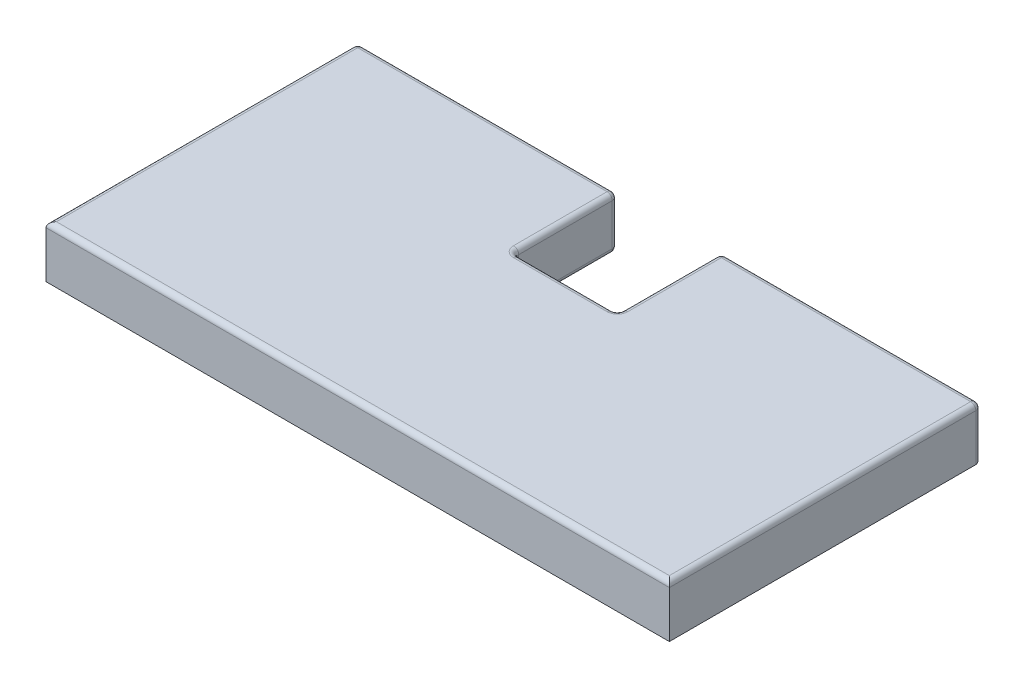
ISO-10303-21;
HEADER;
FILE_DESCRIPTION(('STEP AP214'),'2;1');
FILE_NAME('part.step','',(''),(''),'','','');
FILE_SCHEMA(('AUTOMOTIVE_DESIGN { 1 0 10303 214 1 1 1 1 }'));
ENDSEC;
DATA;
#1=APPLICATION_CONTEXT('core data for automotive mechanical design processes');
#2=APPLICATION_PROTOCOL_DEFINITION('international standard','automotive_design',2000,#1);
#3=PRODUCT_CONTEXT('',#1,'mechanical');
#4=PRODUCT('Part','Part','',(#3));
#5=PRODUCT_RELATED_PRODUCT_CATEGORY('part','',(#4));
#6=PRODUCT_DEFINITION_FORMATION('','',#4);
#7=PRODUCT_DEFINITION_CONTEXT('part definition',#1,'design');
#8=PRODUCT_DEFINITION('design','',#6,#7);
#9=PRODUCT_DEFINITION_SHAPE('','',#8);
#10=(LENGTH_UNIT() NAMED_UNIT(*) SI_UNIT(.MILLI.,.METRE.));
#11=(NAMED_UNIT(*) PLANE_ANGLE_UNIT() SI_UNIT($,.RADIAN.));
#12=(NAMED_UNIT(*) SI_UNIT($,.STERADIAN.) SOLID_ANGLE_UNIT());
#13=UNCERTAINTY_MEASURE_WITH_UNIT(LENGTH_MEASURE(1.E-05),#10,'distance_accuracy_value','');
#14=(GEOMETRIC_REPRESENTATION_CONTEXT(3) GLOBAL_UNCERTAINTY_ASSIGNED_CONTEXT((#13)) GLOBAL_UNIT_ASSIGNED_CONTEXT((#10,
#11,#12)) REPRESENTATION_CONTEXT('',''));
#15=CARTESIAN_POINT('',(0.,0.,0.));
#16=DIRECTION('',(0.,0.,1.));
#17=DIRECTION('',(1.,0.,0.));
#18=AXIS2_PLACEMENT_3D('',#15,#16,#17);
#19=CARTESIAN_POINT('',(-516.052613815904,5.,-370.540919523258));
#20=DIRECTION('',(0.,0.,-1.));
#21=DIRECTION('',(-1.,0.,0.));
#22=AXIS2_PLACEMENT_3D('',#19,#20,#21);
#23=PLANE('',#22);
#24=DIRECTION('',(1.,0.,0.));
#25=VECTOR('',#24,1.);
#26=CARTESIAN_POINT('',(-516.052613815904,4.5,-370.540919523258));
#27=LINE('',#26,#25);
#28=CARTESIAN_POINT('',(-515.552613815904,4.5,-370.540919523258));
#29=VERTEX_POINT('',#28);
#30=CARTESIAN_POINT('',(-491.552613815904,4.5,-370.540919523258));
#31=VERTEX_POINT('',#30);
#32=EDGE_CURVE('E245',#29,#31,#27,.T.);
#33=ORIENTED_EDGE('',*,*,#32,.T.);
#34=DIRECTION('',(0.,-1.,0.));
#35=VECTOR('',#34,1.);
#36=CARTESIAN_POINT('',(-491.552613815904,5.,-370.540919523258));
#37=LINE('',#36,#35);
#38=CARTESIAN_POINT('',(-491.552613815904,0.5,-370.540919523258));
#39=VERTEX_POINT('',#38);
#40=EDGE_CURVE('E249',#31,#39,#37,.T.);
#41=ORIENTED_EDGE('',*,*,#40,.T.);
#42=DIRECTION('',(1.,0.,0.));
#43=VECTOR('',#42,1.);
#44=CARTESIAN_POINT('',(-516.052613815904,0.5,-370.540919523258));
#45=LINE('',#44,#43);
#46=CARTESIAN_POINT('',(-515.552613815904,0.5,-370.540919523258));
#47=VERTEX_POINT('',#46);
#48=EDGE_CURVE('E247',#39,#47,#45,.F.);
#49=ORIENTED_EDGE('',*,*,#48,.T.);
#50=DIRECTION('',(0.,-1.,0.));
#51=VECTOR('',#50,1.);
#52=CARTESIAN_POINT('',(-515.552613815904,5.,-370.540919523258));
#53=LINE('',#52,#51);
#54=EDGE_CURVE('E243',#47,#29,#53,.F.);
#55=ORIENTED_EDGE('',*,*,#54,.T.);
#56=EDGE_LOOP('',(#33,#41,#49,#55));
#57=FACE_BOUND('',#56,.T.);
#58=ADVANCED_FACE('F34',(#57),#23,.T.);
#59=CARTESIAN_POINT('',(0.,5.,0.));
#60=DIRECTION('',(0.,1.,0.));
#61=DIRECTION('',(0.,0.,1.));
#62=AXIS2_PLACEMENT_3D('',#59,#60,#61);
#63=PLANE('',#62);
#64=DIRECTION('',(1.,0.,0.));
#65=VECTOR('',#64,1.);
#66=CARTESIAN_POINT('',(-456.052613815904,5.,-341.040919523258));
#67=LINE('',#66,#65);
#68=CARTESIAN_POINT('',(-515.552613815904,5.,-341.040919523258));
#69=VERTEX_POINT('',#68);
#70=CARTESIAN_POINT('',(-456.552613815904,5.,-341.040919523258));
#71=VERTEX_POINT('',#70);
#72=EDGE_CURVE('E272',#69,#71,#67,.T.);
#73=ORIENTED_EDGE('',*,*,#72,.T.);
#74=DIRECTION('',(0.,0.,1.));
#75=VECTOR('',#74,1.);
#76=CARTESIAN_POINT('',(-456.552613815904,5.,0.));
#77=LINE('',#76,#75);
#78=CARTESIAN_POINT('',(-456.552613815904,5.,-370.040919523258));
#79=VERTEX_POINT('',#78);
#80=EDGE_CURVE('E281',#71,#79,#77,.F.);
#81=ORIENTED_EDGE('',*,*,#80,.T.);
#82=DIRECTION('',(1.,0.,0.));
#83=VECTOR('',#82,1.);
#84=CARTESIAN_POINT('',(0.,5.,-370.040919523258));
#85=LINE('',#84,#83);
#86=CARTESIAN_POINT('',(-480.552613815904,5.,-370.040919523258));
#87=VERTEX_POINT('',#86);
#88=EDGE_CURVE('E279',#79,#87,#85,.F.);
#89=ORIENTED_EDGE('',*,*,#88,.T.);
#90=DIRECTION('',(0.,0.,-1.));
#91=VECTOR('',#90,1.);
#92=CARTESIAN_POINT('',(-480.552613815904,5.,-360.540919523258));
#93=LINE('',#92,#91);
#94=CARTESIAN_POINT('',(-480.552613815904,5.,-361.040919523258));
#95=VERTEX_POINT('',#94);
#96=EDGE_CURVE('E277',#87,#95,#93,.F.);
#97=ORIENTED_EDGE('',*,*,#96,.T.);
#98=CARTESIAN_POINT('',(-481.552613815904,5.,-361.040919523258));
#99=DIRECTION('',(0.,1.,0.));
#100=DIRECTION('',(0.,0.,1.));
#101=AXIS2_PLACEMENT_3D('',#98,#99,#100);
#102=CIRCLE('',#101,1.);
#103=CARTESIAN_POINT('',(-481.552613815904,5.,-360.040919523258));
#104=VERTEX_POINT('',#103);
#105=EDGE_CURVE('E274',#104,#95,#102,.T.);
#106=ORIENTED_EDGE('',*,*,#105,.F.);
#107=DIRECTION('',(-1.,0.,0.));
#108=VECTOR('',#107,1.);
#109=CARTESIAN_POINT('',(-491.052613815904,5.,-360.040919523258));
#110=LINE('',#109,#108);
#111=CARTESIAN_POINT('',(-490.552613815904,5.,-360.040919523258));
#112=VERTEX_POINT('',#111);
#113=EDGE_CURVE('E269',#104,#112,#110,.T.);
#114=ORIENTED_EDGE('',*,*,#113,.T.);
#115=CARTESIAN_POINT('',(-490.552613815904,5.,-361.040919523258));
#116=DIRECTION('',(0.,1.,0.));
#117=DIRECTION('',(0.,0.,1.));
#118=AXIS2_PLACEMENT_3D('',#115,#116,#117);
#119=CIRCLE('',#118,1.);
#120=CARTESIAN_POINT('',(-491.552613815904,5.,-361.040919523258));
#121=VERTEX_POINT('',#120);
#122=EDGE_CURVE('E267',#121,#112,#119,.T.);
#123=ORIENTED_EDGE('',*,*,#122,.F.);
#124=DIRECTION('',(0.,0.,-1.));
#125=VECTOR('',#124,1.);
#126=CARTESIAN_POINT('',(-491.552613815904,5.,0.));
#127=LINE('',#126,#125);
#128=CARTESIAN_POINT('',(-491.552613815904,5.,-370.040919523258));
#129=VERTEX_POINT('',#128);
#130=EDGE_CURVE('E265',#121,#129,#127,.T.);
#131=ORIENTED_EDGE('',*,*,#130,.T.);
#132=DIRECTION('',(1.,0.,0.));
#133=VECTOR('',#132,1.);
#134=CARTESIAN_POINT('',(0.,5.,-370.040919523258));
#135=LINE('',#134,#133);
#136=CARTESIAN_POINT('',(-515.552613815904,5.,-370.040919523258));
#137=VERTEX_POINT('',#136);
#138=EDGE_CURVE('E261',#129,#137,#135,.F.);
#139=ORIENTED_EDGE('',*,*,#138,.T.);
#140=DIRECTION('',(0.,0.,1.));
#141=VECTOR('',#140,1.);
#142=CARTESIAN_POINT('',(-515.552613815904,5.,-340.540919523258));
#143=LINE('',#142,#141);
#144=EDGE_CURVE('E263',#137,#69,#143,.T.);
#145=ORIENTED_EDGE('',*,*,#144,.T.);
#146=EDGE_LOOP('',(#73,#81,#89,#97,#106,#114,#123,#131,#139,#145));
#147=FACE_BOUND('',#146,.T.);
#148=ADVANCED_FACE('F497',(#147),#63,.T.);
#149=CARTESIAN_POINT('',(0.,0.,0.));
#150=DIRECTION('',(0.,1.,0.));
#151=DIRECTION('',(0.,0.,1.));
#152=AXIS2_PLACEMENT_3D('',#149,#150,#151);
#153=PLANE('',#152);
#154=DIRECTION('',(0.,0.,-1.));
#155=VECTOR('',#154,1.);
#156=CARTESIAN_POINT('',(-480.552613815904,0.,0.));
#157=LINE('',#156,#155);
#158=CARTESIAN_POINT('',(-480.552613815904,0.,-361.040919523258));
#159=VERTEX_POINT('',#158);
#160=CARTESIAN_POINT('',(-480.552613815904,0.,-370.040919523258));
#161=VERTEX_POINT('',#160);
#162=EDGE_CURVE('E230',#159,#161,#157,.T.);
#163=ORIENTED_EDGE('',*,*,#162,.T.);
#164=DIRECTION('',(1.,0.,0.));
#165=VECTOR('',#164,1.);
#166=CARTESIAN_POINT('',(-456.052613815904,0.,-370.040919523258));
#167=LINE('',#166,#165);
#168=CARTESIAN_POINT('',(-456.052613815904,0.,-370.040919523258));
#169=VERTEX_POINT('',#168);
#170=EDGE_CURVE('E232',#161,#169,#167,.T.);
#171=ORIENTED_EDGE('',*,*,#170,.T.);
#172=DIRECTION('',(0.,0.,1.));
#173=VECTOR('',#172,1.);
#174=CARTESIAN_POINT('',(-456.052613815904,0.,-370.540919523258));
#175=LINE('',#174,#173);
#176=CARTESIAN_POINT('',(-456.052613815904,0.,-340.540919523258));
#177=VERTEX_POINT('',#176);
#178=EDGE_CURVE('E204',#169,#177,#175,.T.);
#179=ORIENTED_EDGE('',*,*,#178,.T.);
#180=DIRECTION('',(1.,0.,0.));
#181=VECTOR('',#180,1.);
#182=CARTESIAN_POINT('',(-516.052613815904,0.,-340.540919523258));
#183=LINE('',#182,#181);
#184=CARTESIAN_POINT('',(-516.052613815904,0.,-340.540919523258));
#185=VERTEX_POINT('',#184);
#186=EDGE_CURVE('E186',#185,#177,#183,.T.);
#187=ORIENTED_EDGE('',*,*,#186,.F.);
#188=DIRECTION('',(0.,0.,1.));
#189=VECTOR('',#188,1.);
#190=CARTESIAN_POINT('',(-516.052613815904,0.,-370.540919523258));
#191=LINE('',#190,#189);
#192=CARTESIAN_POINT('',(-516.052613815904,0.,-370.040919523258));
#193=VERTEX_POINT('',#192);
#194=EDGE_CURVE('E195',#193,#185,#191,.T.);
#195=ORIENTED_EDGE('',*,*,#194,.F.);
#196=DIRECTION('',(1.,0.,0.));
#197=VECTOR('',#196,1.);
#198=CARTESIAN_POINT('',(-491.052613815904,0.,-370.040919523258));
#199=LINE('',#198,#197);
#200=CARTESIAN_POINT('',(-491.552613815904,0.,-370.040919523258));
#201=VERTEX_POINT('',#200);
#202=EDGE_CURVE('E217',#193,#201,#199,.T.);
#203=ORIENTED_EDGE('',*,*,#202,.T.);
#204=DIRECTION('',(0.,0.,-1.));
#205=VECTOR('',#204,1.);
#206=CARTESIAN_POINT('',(-491.552613815904,0.,-360.540919523258));
#207=LINE('',#206,#205);
#208=CARTESIAN_POINT('',(-491.552613815904,0.,-361.040919523258));
#209=VERTEX_POINT('',#208);
#210=EDGE_CURVE('E219',#201,#209,#207,.F.);
#211=ORIENTED_EDGE('',*,*,#210,.T.);
#212=CARTESIAN_POINT('',(-490.552613815904,0.,-361.040919523258));
#213=DIRECTION('',(0.,1.,0.));
#214=DIRECTION('',(0.,0.,1.));
#215=AXIS2_PLACEMENT_3D('',#212,#213,#214);
#216=CIRCLE('',#215,1.);
#217=CARTESIAN_POINT('',(-490.552613815904,0.,-360.040919523258));
#218=VERTEX_POINT('',#217);
#219=EDGE_CURVE('E222',#218,#209,#216,.F.);
#220=ORIENTED_EDGE('',*,*,#219,.F.);
#221=DIRECTION('',(-1.,0.,0.));
#222=VECTOR('',#221,1.);
#223=CARTESIAN_POINT('',(0.,0.,-360.040919523258));
#224=LINE('',#223,#222);
#225=CARTESIAN_POINT('',(-481.552613815904,0.,-360.040919523258));
#226=VERTEX_POINT('',#225);
#227=EDGE_CURVE('E225',#218,#226,#224,.F.);
#228=ORIENTED_EDGE('',*,*,#227,.T.);
#229=CARTESIAN_POINT('',(-481.552613815904,0.,-361.040919523258));
#230=DIRECTION('',(0.,1.,0.));
#231=DIRECTION('',(0.,0.,1.));
#232=AXIS2_PLACEMENT_3D('',#229,#230,#231);
#233=CIRCLE('',#232,1.);
#234=EDGE_CURVE('E227',#159,#226,#233,.F.);
#235=ORIENTED_EDGE('',*,*,#234,.F.);
#236=EDGE_LOOP('',(#163,#171,#179,#187,#195,#203,#211,#220,#228,#235));
#237=FACE_BOUND('',#236,.T.);
#238=ADVANCED_FACE('F203',(#237),#153,.F.);
#239=CARTESIAN_POINT('',(-516.052613815904,5.,-370.540919523258));
#240=DIRECTION('',(1.,0.,0.));
#241=DIRECTION('',(0.,0.,-1.));
#242=AXIS2_PLACEMENT_3D('',#239,#240,#241);
#243=PLANE('',#242);
#244=DIRECTION('',(0.,-1.,0.));
#245=VECTOR('',#244,1.);
#246=CARTESIAN_POINT('',(-516.052613815904,5.,-340.540919523258));
#247=LINE('',#246,#245);
#248=CARTESIAN_POINT('',(-516.052613815904,4.5,-340.540919523258));
#249=VERTEX_POINT('',#248);
#250=EDGE_CURVE('E182',#249,#185,#247,.T.);
#251=ORIENTED_EDGE('',*,*,#250,.F.);
#252=DIRECTION('',(0.,0.,1.));
#253=VECTOR('',#252,1.);
#254=CARTESIAN_POINT('',(-516.052613815904,4.5,-370.540919523258));
#255=LINE('',#254,#253);
#256=CARTESIAN_POINT('',(-516.052613815904,4.5,-370.040919523258));
#257=VERTEX_POINT('',#256);
#258=EDGE_CURVE('E293',#249,#257,#255,.F.);
#259=ORIENTED_EDGE('',*,*,#258,.T.);
#260=DIRECTION('',(0.,-1.,0.));
#261=VECTOR('',#260,1.);
#262=CARTESIAN_POINT('',(-516.052613815904,0.,-370.040919523258));
#263=LINE('',#262,#261);
#264=EDGE_CURVE('E198',#257,#193,#263,.T.);
#265=ORIENTED_EDGE('',*,*,#264,.T.);
#266=ORIENTED_EDGE('',*,*,#194,.T.);
#267=EDGE_LOOP('',(#251,#259,#265,#266));
#268=FACE_BOUND('',#267,.T.);
#269=ADVANCED_FACE('F196',(#268),#243,.F.);
#270=CARTESIAN_POINT('',(-516.052613815904,5.,-340.540919523258));
#271=DIRECTION('',(0.,0.,-1.));
#272=DIRECTION('',(-1.,0.,0.));
#273=AXIS2_PLACEMENT_3D('',#270,#271,#272);
#274=PLANE('',#273);
#275=DIRECTION('',(0.,-1.,0.));
#276=VECTOR('',#275,1.);
#277=CARTESIAN_POINT('',(-456.052613815904,5.,-340.540919523258));
#278=LINE('',#277,#276);
#279=CARTESIAN_POINT('',(-456.052613815904,4.5,-340.540919523258));
#280=VERTEX_POINT('',#279);
#281=EDGE_CURVE('E192',#280,#177,#278,.T.);
#282=ORIENTED_EDGE('',*,*,#281,.F.);
#283=DIRECTION('',(1.,0.,0.));
#284=VECTOR('',#283,1.);
#285=CARTESIAN_POINT('',(-516.052613815904,4.5,-340.540919523258));
#286=LINE('',#285,#284);
#287=EDGE_CURVE('E188',#280,#249,#286,.F.);
#288=ORIENTED_EDGE('',*,*,#287,.T.);
#289=ORIENTED_EDGE('',*,*,#250,.T.);
#290=ORIENTED_EDGE('',*,*,#186,.T.);
#291=EDGE_LOOP('',(#282,#288,#289,#290));
#292=FACE_BOUND('',#291,.T.);
#293=ADVANCED_FACE('F184',(#292),#274,.F.);
#294=CARTESIAN_POINT('',(-456.052613815904,5.,-370.540919523258));
#295=DIRECTION('',(1.,0.,0.));
#296=DIRECTION('',(0.,0.,-1.));
#297=AXIS2_PLACEMENT_3D('',#294,#295,#296);
#298=PLANE('',#297);
#299=DIRECTION('',(0.,-1.,0.));
#300=VECTOR('',#299,1.);
#301=CARTESIAN_POINT('',(-456.052613815904,5.,-370.040919523258));
#302=LINE('',#301,#300);
#303=CARTESIAN_POINT('',(-456.052613815904,4.5,-370.040919523258));
#304=VERTEX_POINT('',#303);
#305=EDGE_CURVE('E43',#169,#304,#302,.F.);
#306=ORIENTED_EDGE('',*,*,#305,.T.);
#307=DIRECTION('',(0.,0.,1.));
#308=VECTOR('',#307,1.);
#309=CARTESIAN_POINT('',(-456.052613815904,4.5,-370.540919523258));
#310=LINE('',#309,#308);
#311=EDGE_CURVE('E11',#304,#280,#310,.T.);
#312=ORIENTED_EDGE('',*,*,#311,.T.);
#313=ORIENTED_EDGE('',*,*,#281,.T.);
#314=ORIENTED_EDGE('',*,*,#178,.F.);
#315=EDGE_LOOP('',(#306,#312,#313,#314));
#316=FACE_BOUND('',#315,.T.);
#317=ADVANCED_FACE('F483',(#316),#298,.T.);
#318=DIRECTION('',(1.,0.,0.));
#319=VECTOR('',#318,1.);
#320=CARTESIAN_POINT('',(-481.052613815904,0.5,-370.540919523258));
#321=LINE('',#320,#319);
#322=CARTESIAN_POINT('',(-456.552613815904,0.5,-370.540919523258));
#323=VERTEX_POINT('',#322);
#324=CARTESIAN_POINT('',(-480.552613815904,0.5,-370.540919523258));
#325=VERTEX_POINT('',#324);
#326=EDGE_CURVE('E256',#323,#325,#321,.F.);
#327=ORIENTED_EDGE('',*,*,#326,.T.);
#328=DIRECTION('',(0.,-1.,0.));
#329=VECTOR('',#328,1.);
#330=CARTESIAN_POINT('',(-480.552613815904,5.,-370.540919523258));
#331=LINE('',#330,#329);
#332=CARTESIAN_POINT('',(-480.552613815904,4.5,-370.540919523258));
#333=VERTEX_POINT('',#332);
#334=EDGE_CURVE('E258',#325,#333,#331,.F.);
#335=ORIENTED_EDGE('',*,*,#334,.T.);
#336=DIRECTION('',(1.,0.,0.));
#337=VECTOR('',#336,1.);
#338=CARTESIAN_POINT('',(-516.052613815904,4.5,-370.540919523258));
#339=LINE('',#338,#337);
#340=CARTESIAN_POINT('',(-456.552613815904,4.5,-370.540919523258));
#341=VERTEX_POINT('',#340);
#342=EDGE_CURVE('E254',#333,#341,#339,.T.);
#343=ORIENTED_EDGE('',*,*,#342,.T.);
#344=DIRECTION('',(0.,-1.,0.));
#345=VECTOR('',#344,1.);
#346=CARTESIAN_POINT('',(-456.552613815904,5.,-370.540919523258));
#347=LINE('',#346,#345);
#348=EDGE_CURVE('E252',#341,#323,#347,.T.);
#349=ORIENTED_EDGE('',*,*,#348,.T.);
#350=EDGE_LOOP('',(#327,#335,#343,#349));
#351=FACE_BOUND('',#350,.T.);
#352=ADVANCED_FACE('F486',(#351),#23,.T.);
#353=CARTESIAN_POINT('',(-491.052613815904,5.,-360.540919523258));
#354=DIRECTION('',(1.,0.,0.));
#355=DIRECTION('',(0.,0.,-1.));
#356=AXIS2_PLACEMENT_3D('',#353,#354,#355);
#357=PLANE('',#356);
#358=DIRECTION('',(0.,-1.,0.));
#359=VECTOR('',#358,1.);
#360=CARTESIAN_POINT('',(-491.052613815904,5.,-361.040919523258));
#361=LINE('',#360,#359);
#362=CARTESIAN_POINT('',(-491.052613815904,4.5,-361.040919523258));
#363=VERTEX_POINT('',#362);
#364=CARTESIAN_POINT('',(-491.052613815904,0.5,-361.040919523258));
#365=VERTEX_POINT('',#364);
#366=EDGE_CURVE('E210',#363,#365,#361,.T.);
#367=ORIENTED_EDGE('',*,*,#366,.T.);
#368=DIRECTION('',(0.,0.,-1.));
#369=VECTOR('',#368,1.);
#370=CARTESIAN_POINT('',(-491.052613815904,0.5,-370.540919523258));
#371=LINE('',#370,#369);
#372=CARTESIAN_POINT('',(-491.052613815904,0.5,-370.040919523258));
#373=VERTEX_POINT('',#372);
#374=EDGE_CURVE('E214',#365,#373,#371,.T.);
#375=ORIENTED_EDGE('',*,*,#374,.T.);
#376=DIRECTION('',(0.,-1.,0.));
#377=VECTOR('',#376,1.);
#378=CARTESIAN_POINT('',(-491.052613815904,5.,-370.040919523258));
#379=LINE('',#378,#377);
#380=CARTESIAN_POINT('',(-491.052613815904,4.5,-370.040919523258));
#381=VERTEX_POINT('',#380);
#382=EDGE_CURVE('E212',#373,#381,#379,.F.);
#383=ORIENTED_EDGE('',*,*,#382,.T.);
#384=DIRECTION('',(0.,0.,-1.));
#385=VECTOR('',#384,1.);
#386=CARTESIAN_POINT('',(-491.052613815904,4.5,-360.540919523258));
#387=LINE('',#386,#385);
#388=EDGE_CURVE('E191',#381,#363,#387,.F.);
#389=ORIENTED_EDGE('',*,*,#388,.T.);
#390=EDGE_LOOP('',(#367,#375,#383,#389));
#391=FACE_BOUND('',#390,.T.);
#392=ADVANCED_FACE('F440',(#391),#357,.T.);
#393=CARTESIAN_POINT('',(-481.052613815904,5.,-360.540919523258));
#394=DIRECTION('',(1.,0.,0.));
#395=DIRECTION('',(0.,0.,-1.));
#396=AXIS2_PLACEMENT_3D('',#393,#394,#395);
#397=PLANE('',#396);
#398=DIRECTION('',(0.,-1.,0.));
#399=VECTOR('',#398,1.);
#400=CARTESIAN_POINT('',(-481.052613815904,0.,-370.040919523258));
#401=LINE('',#400,#399);
#402=CARTESIAN_POINT('',(-481.052613815904,4.5,-370.040919523258));
#403=VERTEX_POINT('',#402);
#404=CARTESIAN_POINT('',(-481.052613815904,0.5,-370.040919523258));
#405=VERTEX_POINT('',#404);
#406=EDGE_CURVE('E238',#403,#405,#401,.T.);
#407=ORIENTED_EDGE('',*,*,#406,.T.);
#408=DIRECTION('',(0.,0.,-1.));
#409=VECTOR('',#408,1.);
#410=CARTESIAN_POINT('',(-481.052613815904,0.5,-360.540919523258));
#411=LINE('',#410,#409);
#412=CARTESIAN_POINT('',(-481.052613815904,0.5,-361.040919523258));
#413=VERTEX_POINT('',#412);
#414=EDGE_CURVE('E240',#405,#413,#411,.F.);
#415=ORIENTED_EDGE('',*,*,#414,.T.);
#416=DIRECTION('',(0.,-1.,0.));
#417=VECTOR('',#416,1.);
#418=CARTESIAN_POINT('',(-481.052613815904,5.,-361.040919523258));
#419=LINE('',#418,#417);
#420=CARTESIAN_POINT('',(-481.052613815904,4.5,-361.040919523258));
#421=VERTEX_POINT('',#420);
#422=EDGE_CURVE('E236',#413,#421,#419,.F.);
#423=ORIENTED_EDGE('',*,*,#422,.T.);
#424=DIRECTION('',(0.,0.,-1.));
#425=VECTOR('',#424,1.);
#426=CARTESIAN_POINT('',(-481.052613815904,4.5,-370.540919523258));
#427=LINE('',#426,#425);
#428=EDGE_CURVE('E234',#421,#403,#427,.T.);
#429=ORIENTED_EDGE('',*,*,#428,.T.);
#430=EDGE_LOOP('',(#407,#415,#423,#429));
#431=FACE_BOUND('',#430,.T.);
#432=ADVANCED_FACE('F468',(#431),#397,.F.);
#433=CARTESIAN_POINT('',(0.,0.,-360.540919523258));
#434=DIRECTION('',(0.,0.,1.));
#435=DIRECTION('',(1.,0.,0.));
#436=AXIS2_PLACEMENT_3D('',#433,#434,#435);
#437=PLANE('',#436);
#438=DIRECTION('',(0.,-1.,0.));
#439=VECTOR('',#438,1.);
#440=CARTESIAN_POINT('',(-490.552613815904,0.,-360.540919523258));
#441=LINE('',#440,#439);
#442=CARTESIAN_POINT('',(-490.552613815904,0.5,-360.540919523258));
#443=VERTEX_POINT('',#442);
#444=CARTESIAN_POINT('',(-490.552613815904,4.5,-360.540919523258));
#445=VERTEX_POINT('',#444);
#446=EDGE_CURVE('E287',#443,#445,#441,.F.);
#447=ORIENTED_EDGE('',*,*,#446,.T.);
#448=DIRECTION('',(-1.,0.,0.));
#449=VECTOR('',#448,1.);
#450=CARTESIAN_POINT('',(-481.052613815904,4.5,-360.540919523258));
#451=LINE('',#450,#449);
#452=CARTESIAN_POINT('',(-481.552613815904,4.5,-360.540919523258));
#453=VERTEX_POINT('',#452);
#454=EDGE_CURVE('E289',#445,#453,#451,.F.);
#455=ORIENTED_EDGE('',*,*,#454,.T.);
#456=DIRECTION('',(0.,-1.,0.));
#457=VECTOR('',#456,1.);
#458=CARTESIAN_POINT('',(-481.552613815904,0.,-360.540919523258));
#459=LINE('',#458,#457);
#460=CARTESIAN_POINT('',(-481.552613815904,0.5,-360.540919523258));
#461=VERTEX_POINT('',#460);
#462=EDGE_CURVE('E283',#453,#461,#459,.T.);
#463=ORIENTED_EDGE('',*,*,#462,.T.);
#464=DIRECTION('',(-1.,0.,0.));
#465=VECTOR('',#464,1.);
#466=CARTESIAN_POINT('',(0.,0.5,-360.540919523258));
#467=LINE('',#466,#465);
#468=EDGE_CURVE('E285',#461,#443,#467,.T.);
#469=ORIENTED_EDGE('',*,*,#468,.T.);
#470=EDGE_LOOP('',(#447,#455,#463,#469));
#471=FACE_BOUND('',#470,.T.);
#472=ADVANCED_FACE('F595',(#471),#437,.F.);
#473=CARTESIAN_POINT('',(-516.052613815904,4.5,-370.040919523258));
#474=DIRECTION('',(1.,0.,0.));
#475=DIRECTION('',(0.,0.,-1.));
#476=AXIS2_PLACEMENT_3D('',#473,#474,#475);
#477=CYLINDRICAL_SURFACE('',#476,0.5);
#478=CARTESIAN_POINT('',(-456.552613815904,4.5,-370.040919523258));
#479=DIRECTION('',(1.,0.,0.));
#480=DIRECTION('',(0.,0.,-1.));
#481=AXIS2_PLACEMENT_3D('',#478,#479,#480);
#482=CIRCLE('',#481,0.5);
#483=EDGE_CURVE('E38',#341,#79,#482,.T.);
#484=ORIENTED_EDGE('',*,*,#483,.F.);
#485=ORIENTED_EDGE('',*,*,#342,.F.);
#486=CARTESIAN_POINT('',(-480.552613815904,4.5,-370.040919523258));
#487=DIRECTION('',(-1.,0.,0.));
#488=DIRECTION('',(0.,0.,1.));
#489=AXIS2_PLACEMENT_3D('',#486,#487,#488);
#490=CIRCLE('',#489,0.5);
#491=EDGE_CURVE('E385',#87,#333,#490,.T.);
#492=ORIENTED_EDGE('',*,*,#491,.F.);
#493=ORIENTED_EDGE('',*,*,#88,.F.);
#494=EDGE_LOOP('',(#484,#485,#492,#493));
#495=FACE_BOUND('',#494,.T.);
#496=ADVANCED_FACE('F36',(#495),#477,.T.);
#497=CARTESIAN_POINT('',(-456.552613815904,4.5,-370.040919523258));
#498=DIRECTION('',(0.,0.,1.));
#499=DIRECTION('',(1.,0.,0.));
#500=AXIS2_PLACEMENT_3D('',#497,#498,#499);
#501=SPHERICAL_SURFACE('',#500,0.5);
#502=CARTESIAN_POINT('',(-456.552613815904,4.5,-370.040919523258));
#503=DIRECTION('',(0.,0.,-1.));
#504=DIRECTION('',(-1.,0.,0.));
#505=AXIS2_PLACEMENT_3D('',#502,#503,#504);
#506=CIRCLE('',#505,0.5);
#507=EDGE_CURVE('E382',#304,#79,#506,.F.);
#508=ORIENTED_EDGE('',*,*,#507,.F.);
#509=CARTESIAN_POINT('',(-456.552613815904,4.5,-370.040919523258));
#510=DIRECTION('',(0.,1.,0.));
#511=DIRECTION('',(0.,0.,1.));
#512=AXIS2_PLACEMENT_3D('',#509,#510,#511);
#513=CIRCLE('',#512,0.5);
#514=EDGE_CURVE('E387',#341,#304,#513,.F.);
#515=ORIENTED_EDGE('',*,*,#514,.F.);
#516=ORIENTED_EDGE('',*,*,#483,.T.);
#517=EDGE_LOOP('',(#508,#515,#516));
#518=FACE_BOUND('',#517,.T.);
#519=ADVANCED_FACE('F395',(#518),#501,.T.);
#520=CARTESIAN_POINT('',(-456.552613815904,5.,-370.040919523258));
#521=DIRECTION('',(0.,-1.,0.));
#522=DIRECTION('',(0.,0.,-1.));
#523=AXIS2_PLACEMENT_3D('',#520,#521,#522);
#524=CYLINDRICAL_SURFACE('',#523,0.5);
#525=ORIENTED_EDGE('',*,*,#514,.T.);
#526=ORIENTED_EDGE('',*,*,#305,.F.);
#527=CARTESIAN_POINT('',(-456.552613815904,0.5,-370.040919523258));
#528=DIRECTION('',(-0.707106781186547,-0.707106781186547,0.));
#529=DIRECTION('',(0.707106781186547,-0.707106781186547,0.));
#530=AXIS2_PLACEMENT_3D('',#527,#528,#529);
#531=ELLIPSE('',#530,0.707106781186547,0.5);
#532=EDGE_CURVE('E379',#323,#169,#531,.T.);
#533=ORIENTED_EDGE('',*,*,#532,.F.);
#534=ORIENTED_EDGE('',*,*,#348,.F.);
#535=EDGE_LOOP('',(#525,#526,#533,#534));
#536=FACE_BOUND('',#535,.T.);
#537=ADVANCED_FACE('F484',(#536),#524,.T.);
#538=CARTESIAN_POINT('',(-480.552613815904,4.5,-370.040919523258));
#539=DIRECTION('',(0.,0.,1.));
#540=DIRECTION('',(1.,0.,0.));
#541=AXIS2_PLACEMENT_3D('',#538,#539,#540);
#542=SPHERICAL_SURFACE('',#541,0.5);
#543=CARTESIAN_POINT('',(-480.552613815904,4.5,-370.040919523258));
#544=DIRECTION('',(0.,0.,-1.));
#545=DIRECTION('',(-1.,0.,0.));
#546=AXIS2_PLACEMENT_3D('',#543,#544,#545);
#547=CIRCLE('',#546,0.5);
#548=EDGE_CURVE('E374',#87,#403,#547,.F.);
#549=ORIENTED_EDGE('',*,*,#548,.F.);
#550=ORIENTED_EDGE('',*,*,#491,.T.);
#551=CARTESIAN_POINT('',(-480.552613815904,4.5,-370.040919523258));
#552=DIRECTION('',(0.,1.,0.));
#553=DIRECTION('',(0.,0.,1.));
#554=AXIS2_PLACEMENT_3D('',#551,#552,#553);
#555=CIRCLE('',#554,0.5);
#556=EDGE_CURVE('E377',#403,#333,#555,.F.);
#557=ORIENTED_EDGE('',*,*,#556,.F.);
#558=EDGE_LOOP('',(#549,#550,#557));
#559=FACE_BOUND('',#558,.T.);
#560=ADVANCED_FACE('F492',(#559),#542,.T.);
#561=CARTESIAN_POINT('',(-456.552613815904,4.5,-370.540919523258));
#562=DIRECTION('',(0.,0.,1.));
#563=DIRECTION('',(1.,0.,0.));
#564=AXIS2_PLACEMENT_3D('',#561,#562,#563);
#565=CYLINDRICAL_SURFACE('',#564,0.5);
#566=ORIENTED_EDGE('',*,*,#507,.T.);
#567=ORIENTED_EDGE('',*,*,#80,.F.);
#568=CARTESIAN_POINT('',(-456.552613815904,4.5,-341.040919523258));
#569=DIRECTION('',(-0.707106781186547,0.,0.707106781186547));
#570=DIRECTION('',(0.707106781186547,0.,0.707106781186547));
#571=AXIS2_PLACEMENT_3D('',#568,#569,#570);
#572=ELLIPSE('',#571,0.707106781186547,0.5);
#573=EDGE_CURVE('E371',#280,#71,#572,.T.);
#574=ORIENTED_EDGE('',*,*,#573,.F.);
#575=ORIENTED_EDGE('',*,*,#311,.F.);
#576=EDGE_LOOP('',(#566,#567,#574,#575));
#577=FACE_BOUND('',#576,.T.);
#578=ADVANCED_FACE('F401',(#577),#565,.T.);
#579=CARTESIAN_POINT('',(0.,0.5,-370.040919523258));
#580=DIRECTION('',(-1.,0.,0.));
#581=DIRECTION('',(0.,0.,1.));
#582=AXIS2_PLACEMENT_3D('',#579,#580,#581);
#583=CYLINDRICAL_SURFACE('',#582,0.5);
#584=ORIENTED_EDGE('',*,*,#532,.T.);
#585=ORIENTED_EDGE('',*,*,#170,.F.);
#586=CARTESIAN_POINT('',(-480.552613815904,0.5,-370.040919523258));
#587=DIRECTION('',(-1.,0.,0.));
#588=DIRECTION('',(0.,0.,1.));
#589=AXIS2_PLACEMENT_3D('',#586,#587,#588);
#590=CIRCLE('',#589,0.5);
#591=EDGE_CURVE('E368',#325,#161,#590,.T.);
#592=ORIENTED_EDGE('',*,*,#591,.F.);
#593=ORIENTED_EDGE('',*,*,#326,.F.);
#594=EDGE_LOOP('',(#584,#585,#592,#593));
#595=FACE_BOUND('',#594,.T.);
#596=ADVANCED_FACE('F481',(#595),#583,.T.);
#597=CARTESIAN_POINT('',(-480.552613815904,5.,-370.040919523258));
#598=DIRECTION('',(0.,1.,0.));
#599=DIRECTION('',(0.,0.,1.));
#600=AXIS2_PLACEMENT_3D('',#597,#598,#599);
#601=CYLINDRICAL_SURFACE('',#600,0.5);
#602=ORIENTED_EDGE('',*,*,#556,.T.);
#603=ORIENTED_EDGE('',*,*,#334,.F.);
#604=CARTESIAN_POINT('',(-480.552613815904,0.5,-370.040919523258));
#605=DIRECTION('',(0.,-1.,0.));
#606=DIRECTION('',(0.,0.,-1.));
#607=AXIS2_PLACEMENT_3D('',#604,#605,#606);
#608=CIRCLE('',#607,0.5);
#609=EDGE_CURVE('E365',#405,#325,#608,.T.);
#610=ORIENTED_EDGE('',*,*,#609,.F.);
#611=ORIENTED_EDGE('',*,*,#406,.F.);
#612=EDGE_LOOP('',(#602,#603,#610,#611));
#613=FACE_BOUND('',#612,.T.);
#614=ADVANCED_FACE('F474',(#613),#601,.T.);
#615=CARTESIAN_POINT('',(-480.552613815904,4.5,-360.540919523258));
#616=DIRECTION('',(0.,0.,1.));
#617=DIRECTION('',(1.,0.,0.));
#618=AXIS2_PLACEMENT_3D('',#615,#616,#617);
#619=CYLINDRICAL_SURFACE('',#618,0.5);
#620=ORIENTED_EDGE('',*,*,#548,.T.);
#621=ORIENTED_EDGE('',*,*,#428,.F.);
#622=CARTESIAN_POINT('',(-480.552613815904,4.5,-361.040919523258));
#623=DIRECTION('',(0.,0.,1.));
#624=DIRECTION('',(1.,0.,0.));
#625=AXIS2_PLACEMENT_3D('',#622,#623,#624);
#626=CIRCLE('',#625,0.5);
#627=EDGE_CURVE('E362',#95,#421,#626,.T.);
#628=ORIENTED_EDGE('',*,*,#627,.F.);
#629=ORIENTED_EDGE('',*,*,#96,.F.);
#630=EDGE_LOOP('',(#620,#621,#628,#629));
#631=FACE_BOUND('',#630,.T.);
#632=ADVANCED_FACE('F495',(#631),#619,.T.);
#633=CARTESIAN_POINT('',(0.,4.5,-341.040919523258));
#634=DIRECTION('',(-1.,0.,0.));
#635=DIRECTION('',(0.,0.,1.));
#636=AXIS2_PLACEMENT_3D('',#633,#634,#635);
#637=CYLINDRICAL_SURFACE('',#636,0.5);
#638=ORIENTED_EDGE('',*,*,#573,.T.);
#639=ORIENTED_EDGE('',*,*,#72,.F.);
#640=CARTESIAN_POINT('',(-515.552613815904,4.5,-341.040919523258));
#641=DIRECTION('',(-0.707106781186546,0.,-0.707106781186549));
#642=DIRECTION('',(-0.707106781186549,0.,0.707106781186546));
#643=AXIS2_PLACEMENT_3D('',#640,#641,#642);
#644=ELLIPSE('',#643,0.707106781186549,0.5);
#645=EDGE_CURVE('E359',#249,#69,#644,.T.);
#646=ORIENTED_EDGE('',*,*,#645,.F.);
#647=ORIENTED_EDGE('',*,*,#287,.F.);
#648=EDGE_LOOP('',(#638,#639,#646,#647));
#649=FACE_BOUND('',#648,.T.);
#650=ADVANCED_FACE('F405',(#649),#637,.T.);
#651=CARTESIAN_POINT('',(-480.552613815904,0.5,-370.040919523258));
#652=DIRECTION('',(0.,0.,1.));
#653=DIRECTION('',(1.,0.,0.));
#654=AXIS2_PLACEMENT_3D('',#651,#652,#653);
#655=SPHERICAL_SURFACE('',#654,0.5);
#656=ORIENTED_EDGE('',*,*,#609,.T.);
#657=ORIENTED_EDGE('',*,*,#591,.T.);
#658=CARTESIAN_POINT('',(-480.552613815904,0.5,-370.040919523258));
#659=DIRECTION('',(0.,0.,-1.));
#660=DIRECTION('',(-1.,0.,0.));
#661=AXIS2_PLACEMENT_3D('',#658,#659,#660);
#662=CIRCLE('',#661,0.5);
#663=EDGE_CURVE('E356',#405,#161,#662,.F.);
#664=ORIENTED_EDGE('',*,*,#663,.F.);
#665=EDGE_LOOP('',(#656,#657,#664));
#666=FACE_BOUND('',#665,.T.);
#667=ADVANCED_FACE('F477',(#666),#655,.T.);
#668=CARTESIAN_POINT('',(-481.552613815904,4.5,-361.040919523258));
#669=DIRECTION('',(0.,1.,0.));
#670=DIRECTION('',(0.,0.,1.));
#671=AXIS2_PLACEMENT_3D('',#668,#669,#670);
#672=TOROIDAL_SURFACE('',#671,1.,0.5);
#673=ORIENTED_EDGE('',*,*,#105,.T.);
#674=ORIENTED_EDGE('',*,*,#627,.T.);
#675=CARTESIAN_POINT('',(-481.552613815904,4.5,-361.040919523258));
#676=DIRECTION('',(0.,1.,0.));
#677=DIRECTION('',(0.,0.,1.));
#678=AXIS2_PLACEMENT_3D('',#675,#676,#677);
#679=CIRCLE('',#678,0.5);
#680=EDGE_CURVE('E353',#453,#421,#679,.T.);
#681=ORIENTED_EDGE('',*,*,#680,.F.);
#682=CARTESIAN_POINT('',(-481.552613815904,4.5,-360.040919523258));
#683=DIRECTION('',(1.,0.,0.));
#684=DIRECTION('',(0.,0.,-1.));
#685=AXIS2_PLACEMENT_3D('',#682,#683,#684);
#686=CIRCLE('',#685,0.5);
#687=EDGE_CURVE('E350',#104,#453,#686,.F.);
#688=ORIENTED_EDGE('',*,*,#687,.F.);
#689=EDGE_LOOP('',(#673,#674,#681,#688));
#690=FACE_BOUND('',#689,.T.);
#691=ADVANCED_FACE('F572',(#690),#672,.T.);
#692=CARTESIAN_POINT('',(-515.552613815905,4.5,-1.90792794088033E-12));
#693=DIRECTION('',(0.,0.,-1.));
#694=DIRECTION('',(-1.,0.,0.));
#695=AXIS2_PLACEMENT_3D('',#692,#693,#694);
#696=CYLINDRICAL_SURFACE('',#695,0.5);
#697=ORIENTED_EDGE('',*,*,#645,.T.);
#698=ORIENTED_EDGE('',*,*,#144,.F.);
#699=CARTESIAN_POINT('',(-515.552613815904,4.5,-370.040919523258));
#700=DIRECTION('',(0.,0.,-1.));
#701=DIRECTION('',(-1.,0.,0.));
#702=AXIS2_PLACEMENT_3D('',#699,#700,#701);
#703=CIRCLE('',#702,0.5);
#704=EDGE_CURVE('E344',#257,#137,#703,.T.);
#705=ORIENTED_EDGE('',*,*,#704,.F.);
#706=ORIENTED_EDGE('',*,*,#258,.F.);
#707=EDGE_LOOP('',(#697,#698,#705,#706));
#708=FACE_BOUND('',#707,.T.);
#709=ADVANCED_FACE('F410',(#708),#696,.T.);
#710=CARTESIAN_POINT('',(-480.552613815904,0.5,0.));
#711=DIRECTION('',(0.,0.,-1.));
#712=DIRECTION('',(-1.,0.,0.));
#713=AXIS2_PLACEMENT_3D('',#710,#711,#712);
#714=CYLINDRICAL_SURFACE('',#713,0.5);
#715=ORIENTED_EDGE('',*,*,#663,.T.);
#716=ORIENTED_EDGE('',*,*,#162,.F.);
#717=CARTESIAN_POINT('',(-480.552613815904,0.5,-361.040919523258));
#718=DIRECTION('',(0.,0.,1.));
#719=DIRECTION('',(1.,0.,0.));
#720=AXIS2_PLACEMENT_3D('',#717,#718,#719);
#721=CIRCLE('',#720,0.5);
#722=EDGE_CURVE('E341',#413,#159,#721,.T.);
#723=ORIENTED_EDGE('',*,*,#722,.F.);
#724=ORIENTED_EDGE('',*,*,#414,.F.);
#725=EDGE_LOOP('',(#715,#716,#723,#724));
#726=FACE_BOUND('',#725,.T.);
#727=ADVANCED_FACE('F462',(#726),#714,.T.);
#728=CARTESIAN_POINT('',(-481.552613815904,0.,-361.040919523258));
#729=DIRECTION('',(0.,1.,0.));
#730=DIRECTION('',(0.,0.,1.));
#731=AXIS2_PLACEMENT_3D('',#728,#729,#730);
#732=CYLINDRICAL_SURFACE('',#731,0.5);
#733=ORIENTED_EDGE('',*,*,#680,.T.);
#734=ORIENTED_EDGE('',*,*,#422,.F.);
#735=CARTESIAN_POINT('',(-481.552613815904,0.5,-361.040919523258));
#736=DIRECTION('',(0.,1.,0.));
#737=DIRECTION('',(0.,0.,1.));
#738=AXIS2_PLACEMENT_3D('',#735,#736,#737);
#739=CIRCLE('',#738,0.5);
#740=EDGE_CURVE('E339',#461,#413,#739,.T.);
#741=ORIENTED_EDGE('',*,*,#740,.F.);
#742=ORIENTED_EDGE('',*,*,#462,.F.);
#743=EDGE_LOOP('',(#733,#734,#741,#742));
#744=FACE_BOUND('',#743,.T.);
#745=ADVANCED_FACE('F464',(#744),#732,.F.);
#746=CARTESIAN_POINT('',(0.,4.5,-360.040919523258));
#747=DIRECTION('',(1.,0.,0.));
#748=DIRECTION('',(0.,0.,-1.));
#749=AXIS2_PLACEMENT_3D('',#746,#747,#748);
#750=CYLINDRICAL_SURFACE('',#749,0.5);
#751=ORIENTED_EDGE('',*,*,#687,.T.);
#752=ORIENTED_EDGE('',*,*,#454,.F.);
#753=CARTESIAN_POINT('',(-490.552613815904,4.5,-360.040919523258));
#754=DIRECTION('',(-1.,0.,0.));
#755=DIRECTION('',(0.,0.,1.));
#756=AXIS2_PLACEMENT_3D('',#753,#754,#755);
#757=CIRCLE('',#756,0.5);
#758=EDGE_CURVE('E336',#112,#445,#757,.T.);
#759=ORIENTED_EDGE('',*,*,#758,.F.);
#760=ORIENTED_EDGE('',*,*,#113,.F.);
#761=EDGE_LOOP('',(#751,#752,#759,#760));
#762=FACE_BOUND('',#761,.T.);
#763=ADVANCED_FACE('F562',(#762),#750,.T.);
#764=CARTESIAN_POINT('',(-491.552613815904,4.5,0.));
#765=DIRECTION('',(0.,0.,-1.));
#766=DIRECTION('',(-1.,0.,0.));
#767=AXIS2_PLACEMENT_3D('',#764,#765,#766);
#768=CYLINDRICAL_SURFACE('',#767,0.5);
#769=CARTESIAN_POINT('',(-491.552613815904,4.5,-370.040919523258));
#770=DIRECTION('',(0.,0.,-1.));
#771=DIRECTION('',(-1.,0.,0.));
#772=AXIS2_PLACEMENT_3D('',#769,#770,#771);
#773=CIRCLE('',#772,0.5);
#774=EDGE_CURVE('E330',#129,#381,#773,.T.);
#775=ORIENTED_EDGE('',*,*,#774,.F.);
#776=ORIENTED_EDGE('',*,*,#130,.F.);
#777=CARTESIAN_POINT('',(-491.552613815904,4.5,-361.040919523258));
#778=DIRECTION('',(0.,0.,1.));
#779=DIRECTION('',(1.,0.,0.));
#780=AXIS2_PLACEMENT_3D('',#777,#778,#779);
#781=CIRCLE('',#780,0.5);
#782=EDGE_CURVE('E333',#363,#121,#781,.T.);
#783=ORIENTED_EDGE('',*,*,#782,.F.);
#784=ORIENTED_EDGE('',*,*,#388,.F.);
#785=EDGE_LOOP('',(#775,#776,#783,#784));
#786=FACE_BOUND('',#785,.T.);
#787=ADVANCED_FACE('F507',(#786),#768,.T.);
#788=CARTESIAN_POINT('',(-516.052613815904,4.5,-370.040919523258));
#789=DIRECTION('',(1.,0.,0.));
#790=DIRECTION('',(0.,0.,-1.));
#791=AXIS2_PLACEMENT_3D('',#788,#789,#790);
#792=CYLINDRICAL_SURFACE('',#791,0.5);
#793=CARTESIAN_POINT('',(-515.552613815904,4.5,-370.040919523258));
#794=DIRECTION('',(-1.,0.,0.));
#795=DIRECTION('',(0.,0.,1.));
#796=AXIS2_PLACEMENT_3D('',#793,#794,#795);
#797=CIRCLE('',#796,0.5);
#798=EDGE_CURVE('E347',#137,#29,#797,.T.);
#799=ORIENTED_EDGE('',*,*,#798,.F.);
#800=ORIENTED_EDGE('',*,*,#138,.F.);
#801=CARTESIAN_POINT('',(-491.552613815904,4.5,-370.040919523258));
#802=DIRECTION('',(1.,0.,0.));
#803=DIRECTION('',(0.,0.,-1.));
#804=AXIS2_PLACEMENT_3D('',#801,#802,#803);
#805=CIRCLE('',#804,0.5);
#806=EDGE_CURVE('E327',#31,#129,#805,.T.);
#807=ORIENTED_EDGE('',*,*,#806,.F.);
#808=ORIENTED_EDGE('',*,*,#32,.F.);
#809=EDGE_LOOP('',(#799,#800,#807,#808));
#810=FACE_BOUND('',#809,.T.);
#811=ADVANCED_FACE('F504',(#810),#792,.T.);
#812=CARTESIAN_POINT('',(-515.552613815904,4.5,-370.040919523258));
#813=DIRECTION('',(0.,0.,1.));
#814=DIRECTION('',(1.,0.,0.));
#815=AXIS2_PLACEMENT_3D('',#812,#813,#814);
#816=SPHERICAL_SURFACE('',#815,0.5);
#817=ORIENTED_EDGE('',*,*,#704,.T.);
#818=ORIENTED_EDGE('',*,*,#798,.T.);
#819=CARTESIAN_POINT('',(-515.552613815904,4.5,-370.040919523258));
#820=DIRECTION('',(0.,1.,0.));
#821=DIRECTION('',(0.,0.,1.));
#822=AXIS2_PLACEMENT_3D('',#819,#820,#821);
#823=CIRCLE('',#822,0.5);
#824=EDGE_CURVE('E324',#257,#29,#823,.F.);
#825=ORIENTED_EDGE('',*,*,#824,.F.);
#826=EDGE_LOOP('',(#817,#818,#825));
#827=FACE_BOUND('',#826,.T.);
#828=ADVANCED_FACE('F414',(#827),#816,.T.);
#829=CARTESIAN_POINT('',(-481.552613815904,0.5,-361.040919523258));
#830=DIRECTION('',(0.,1.,0.));
#831=DIRECTION('',(0.,0.,1.));
#832=AXIS2_PLACEMENT_3D('',#829,#830,#831);
#833=TOROIDAL_SURFACE('',#832,1.,0.5);
#834=ORIENTED_EDGE('',*,*,#722,.T.);
#835=ORIENTED_EDGE('',*,*,#234,.T.);
#836=CARTESIAN_POINT('',(-481.552613815904,0.5,-360.040919523258));
#837=DIRECTION('',(1.,0.,0.));
#838=DIRECTION('',(0.,0.,-1.));
#839=AXIS2_PLACEMENT_3D('',#836,#837,#838);
#840=CIRCLE('',#839,0.5);
#841=EDGE_CURVE('E321',#461,#226,#840,.F.);
#842=ORIENTED_EDGE('',*,*,#841,.F.);
#843=ORIENTED_EDGE('',*,*,#740,.T.);
#844=EDGE_LOOP('',(#834,#835,#842,#843));
#845=FACE_BOUND('',#844,.T.);
#846=ADVANCED_FACE('F456',(#845),#833,.T.);
#847=CARTESIAN_POINT('',(-490.552613815904,4.5,-361.040919523258));
#848=DIRECTION('',(0.,1.,0.));
#849=DIRECTION('',(0.,0.,1.));
#850=AXIS2_PLACEMENT_3D('',#847,#848,#849);
#851=TOROIDAL_SURFACE('',#850,1.,0.5);
#852=ORIENTED_EDGE('',*,*,#122,.T.);
#853=ORIENTED_EDGE('',*,*,#758,.T.);
#854=CARTESIAN_POINT('',(-490.552613815904,4.5,-361.040919523258));
#855=DIRECTION('',(0.,1.,0.));
#856=DIRECTION('',(0.,0.,1.));
#857=AXIS2_PLACEMENT_3D('',#854,#855,#856);
#858=CIRCLE('',#857,0.5);
#859=EDGE_CURVE('E318',#363,#445,#858,.T.);
#860=ORIENTED_EDGE('',*,*,#859,.F.);
#861=ORIENTED_EDGE('',*,*,#782,.T.);
#862=EDGE_LOOP('',(#852,#853,#860,#861));
#863=FACE_BOUND('',#862,.T.);
#864=ADVANCED_FACE('F550',(#863),#851,.T.);
#865=CARTESIAN_POINT('',(-491.552613815904,4.5,-370.040919523258));
#866=DIRECTION('',(0.,0.,1.));
#867=DIRECTION('',(1.,0.,0.));
#868=AXIS2_PLACEMENT_3D('',#865,#866,#867);
#869=SPHERICAL_SURFACE('',#868,0.5);
#870=ORIENTED_EDGE('',*,*,#806,.T.);
#871=ORIENTED_EDGE('',*,*,#774,.T.);
#872=CARTESIAN_POINT('',(-491.552613815904,4.5,-370.040919523258));
#873=DIRECTION('',(0.,1.,0.));
#874=DIRECTION('',(0.,0.,1.));
#875=AXIS2_PLACEMENT_3D('',#872,#873,#874);
#876=CIRCLE('',#875,0.5);
#877=EDGE_CURVE('E315',#31,#381,#876,.F.);
#878=ORIENTED_EDGE('',*,*,#877,.F.);
#879=EDGE_LOOP('',(#870,#871,#878));
#880=FACE_BOUND('',#879,.T.);
#881=ADVANCED_FACE('F509',(#880),#869,.T.);
#882=CARTESIAN_POINT('',(-515.552613815904,5.,-370.040919523258));
#883=DIRECTION('',(0.,1.,0.));
#884=DIRECTION('',(0.,0.,1.));
#885=AXIS2_PLACEMENT_3D('',#882,#883,#884);
#886=CYLINDRICAL_SURFACE('',#885,0.5);
#887=ORIENTED_EDGE('',*,*,#824,.T.);
#888=ORIENTED_EDGE('',*,*,#54,.F.);
#889=CARTESIAN_POINT('',(-515.552613815904,0.5,-370.040919523258));
#890=DIRECTION('',(-0.707106781186547,0.707106781186547,0.));
#891=DIRECTION('',(0.707106781186547,0.707106781186547,0.));
#892=AXIS2_PLACEMENT_3D('',#889,#890,#891);
#893=ELLIPSE('',#892,0.707106781186547,0.5);
#894=EDGE_CURVE('E312',#193,#47,#893,.F.);
#895=ORIENTED_EDGE('',*,*,#894,.F.);
#896=ORIENTED_EDGE('',*,*,#264,.F.);
#897=EDGE_LOOP('',(#887,#888,#895,#896));
#898=FACE_BOUND('',#897,.T.);
#899=ADVANCED_FACE('F417',(#898),#886,.T.);
#900=CARTESIAN_POINT('',(0.,0.5,-360.040919523258));
#901=DIRECTION('',(-1.,0.,0.));
#902=DIRECTION('',(0.,0.,1.));
#903=AXIS2_PLACEMENT_3D('',#900,#901,#902);
#904=CYLINDRICAL_SURFACE('',#903,0.5);
#905=ORIENTED_EDGE('',*,*,#841,.T.);
#906=ORIENTED_EDGE('',*,*,#227,.F.);
#907=CARTESIAN_POINT('',(-490.552613815904,0.5,-360.040919523258));
#908=DIRECTION('',(-1.,0.,0.));
#909=DIRECTION('',(0.,0.,1.));
#910=AXIS2_PLACEMENT_3D('',#907,#908,#909);
#911=CIRCLE('',#910,0.5);
#912=EDGE_CURVE('E309',#443,#218,#911,.T.);
#913=ORIENTED_EDGE('',*,*,#912,.F.);
#914=ORIENTED_EDGE('',*,*,#468,.F.);
#915=EDGE_LOOP('',(#905,#906,#913,#914));
#916=FACE_BOUND('',#915,.T.);
#917=ADVANCED_FACE('F452',(#916),#904,.T.);
#918=CARTESIAN_POINT('',(-490.552613815904,5.,-361.040919523258));
#919=DIRECTION('',(0.,-1.,0.));
#920=DIRECTION('',(0.,0.,-1.));
#921=AXIS2_PLACEMENT_3D('',#918,#919,#920);
#922=CYLINDRICAL_SURFACE('',#921,0.5);
#923=ORIENTED_EDGE('',*,*,#859,.T.);
#924=ORIENTED_EDGE('',*,*,#446,.F.);
#925=CARTESIAN_POINT('',(-490.552613815904,0.5,-361.040919523258));
#926=DIRECTION('',(0.,1.,0.));
#927=DIRECTION('',(0.,0.,1.));
#928=AXIS2_PLACEMENT_3D('',#925,#926,#927);
#929=CIRCLE('',#928,0.5);
#930=EDGE_CURVE('E306',#365,#443,#929,.T.);
#931=ORIENTED_EDGE('',*,*,#930,.F.);
#932=ORIENTED_EDGE('',*,*,#366,.F.);
#933=EDGE_LOOP('',(#923,#924,#931,#932));
#934=FACE_BOUND('',#933,.T.);
#935=ADVANCED_FACE('F446',(#934),#922,.F.);
#936=CARTESIAN_POINT('',(-491.552613815904,5.,-370.040919523258));
#937=DIRECTION('',(0.,-1.,0.));
#938=DIRECTION('',(0.,0.,-1.));
#939=AXIS2_PLACEMENT_3D('',#936,#937,#938);
#940=CYLINDRICAL_SURFACE('',#939,0.5);
#941=ORIENTED_EDGE('',*,*,#877,.T.);
#942=ORIENTED_EDGE('',*,*,#382,.F.);
#943=CARTESIAN_POINT('',(-491.552613815904,0.5,-370.040919523258));
#944=DIRECTION('',(0.,-1.,0.));
#945=DIRECTION('',(1.,0.,0.));
#946=AXIS2_PLACEMENT_3D('',#943,#944,#945);
#947=CIRCLE('',#946,0.5);
#948=EDGE_CURVE('E303',#39,#373,#947,.T.);
#949=ORIENTED_EDGE('',*,*,#948,.F.);
#950=ORIENTED_EDGE('',*,*,#40,.F.);
#951=EDGE_LOOP('',(#941,#942,#949,#950));
#952=FACE_BOUND('',#951,.T.);
#953=ADVANCED_FACE('F436',(#952),#940,.T.);
#954=CARTESIAN_POINT('',(0.,0.5,-370.040919523258));
#955=DIRECTION('',(-1.,0.,0.));
#956=DIRECTION('',(0.,0.,1.));
#957=AXIS2_PLACEMENT_3D('',#954,#955,#956);
#958=CYLINDRICAL_SURFACE('',#957,0.5);
#959=ORIENTED_EDGE('',*,*,#894,.T.);
#960=ORIENTED_EDGE('',*,*,#48,.F.);
#961=CARTESIAN_POINT('',(-491.552613815904,0.5,-370.040919523258));
#962=DIRECTION('',(1.,0.,0.));
#963=DIRECTION('',(0.,0.,-1.));
#964=AXIS2_PLACEMENT_3D('',#961,#962,#963);
#965=CIRCLE('',#964,0.5);
#966=EDGE_CURVE('E301',#201,#39,#965,.T.);
#967=ORIENTED_EDGE('',*,*,#966,.F.);
#968=ORIENTED_EDGE('',*,*,#202,.F.);
#969=EDGE_LOOP('',(#959,#960,#967,#968));
#970=FACE_BOUND('',#969,.T.);
#971=ADVANCED_FACE('F422',(#970),#958,.T.);
#972=CARTESIAN_POINT('',(-490.552613815904,0.5,-361.040919523258));
#973=DIRECTION('',(0.,1.,0.));
#974=DIRECTION('',(0.,0.,1.));
#975=AXIS2_PLACEMENT_3D('',#972,#973,#974);
#976=TOROIDAL_SURFACE('',#975,1.,0.5);
#977=ORIENTED_EDGE('',*,*,#912,.T.);
#978=ORIENTED_EDGE('',*,*,#219,.T.);
#979=CARTESIAN_POINT('',(-491.552613815904,0.5,-361.040919523258));
#980=DIRECTION('',(0.,0.,1.));
#981=DIRECTION('',(1.,0.,0.));
#982=AXIS2_PLACEMENT_3D('',#979,#980,#981);
#983=CIRCLE('',#982,0.5);
#984=EDGE_CURVE('E299',#365,#209,#983,.F.);
#985=ORIENTED_EDGE('',*,*,#984,.F.);
#986=ORIENTED_EDGE('',*,*,#930,.T.);
#987=EDGE_LOOP('',(#977,#978,#985,#986));
#988=FACE_BOUND('',#987,.T.);
#989=ADVANCED_FACE('F449',(#988),#976,.T.);
#990=CARTESIAN_POINT('',(-491.552613815904,0.5,-370.040919523258));
#991=DIRECTION('',(0.,0.,1.));
#992=DIRECTION('',(1.,0.,0.));
#993=AXIS2_PLACEMENT_3D('',#990,#991,#992);
#994=SPHERICAL_SURFACE('',#993,0.5);
#995=ORIENTED_EDGE('',*,*,#966,.T.);
#996=ORIENTED_EDGE('',*,*,#948,.T.);
#997=CARTESIAN_POINT('',(-491.552613815904,0.5,-370.040919523258));
#998=DIRECTION('',(0.,0.,-1.));
#999=DIRECTION('',(-1.,0.,0.));
#1000=AXIS2_PLACEMENT_3D('',#997,#998,#999);
#1001=CIRCLE('',#1000,0.5);
#1002=EDGE_CURVE('E297',#201,#373,#1001,.F.);
#1003=ORIENTED_EDGE('',*,*,#1002,.F.);
#1004=EDGE_LOOP('',(#995,#996,#1003));
#1005=FACE_BOUND('',#1004,.T.);
#1006=ADVANCED_FACE('F431',(#1005),#994,.T.);
#1007=CARTESIAN_POINT('',(-491.552613815904,0.5,-360.540919523258));
#1008=DIRECTION('',(0.,0.,1.));
#1009=DIRECTION('',(1.,0.,0.));
#1010=AXIS2_PLACEMENT_3D('',#1007,#1008,#1009);
#1011=CYLINDRICAL_SURFACE('',#1010,0.5);
#1012=ORIENTED_EDGE('',*,*,#984,.T.);
#1013=ORIENTED_EDGE('',*,*,#210,.F.);
#1014=ORIENTED_EDGE('',*,*,#1002,.T.);
#1015=ORIENTED_EDGE('',*,*,#374,.F.);
#1016=EDGE_LOOP('',(#1012,#1013,#1014,#1015));
#1017=FACE_BOUND('',#1016,.T.);
#1018=ADVANCED_FACE('F427',(#1017),#1011,.T.);
#1019=CLOSED_SHELL('',(#58,#148,#238,#269,#293,#317,#352,#392,#432,#472,#496,#519,#537,#560,
#578,#596,#614,#632,#650,#667,#691,#709,#727,#745,#763,#787,#811,#828,#846,#864,#881,#899,#917,
#935,#953,#971,#989,#1006,#1018));
#1020=MANIFOLD_SOLID_BREP('B2',#1019);
#1021=ADVANCED_BREP_SHAPE_REPRESENTATION('',(#18,#1020),#14);
#1022=SHAPE_DEFINITION_REPRESENTATION(#9,#1021);
ENDSEC;
END-ISO-10303-21;
